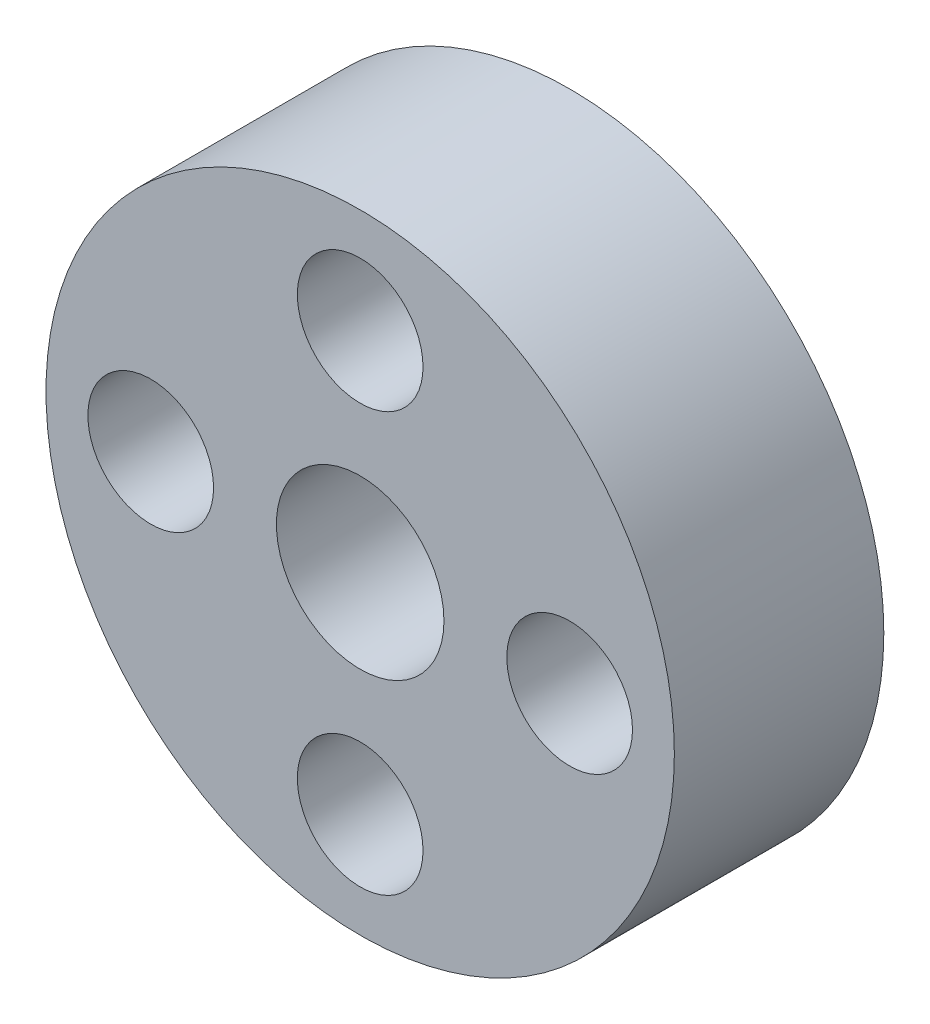
ISO-10303-21;
HEADER;
FILE_DESCRIPTION(('STEP AP214'),'2;1');
FILE_NAME('part.step','',(''),(''),'','','');
FILE_SCHEMA(('AUTOMOTIVE_DESIGN { 1 0 10303 214 1 1 1 1 }'));
ENDSEC;
DATA;
#1=APPLICATION_CONTEXT('core data for automotive mechanical design processes');
#2=APPLICATION_PROTOCOL_DEFINITION('international standard','automotive_design',2000,#1);
#3=PRODUCT_CONTEXT('',#1,'mechanical');
#4=PRODUCT('Part','Part','',(#3));
#5=PRODUCT_RELATED_PRODUCT_CATEGORY('part','',(#4));
#6=PRODUCT_DEFINITION_FORMATION('','',#4);
#7=PRODUCT_DEFINITION_CONTEXT('part definition',#1,'design');
#8=PRODUCT_DEFINITION('design','',#6,#7);
#9=PRODUCT_DEFINITION_SHAPE('','',#8);
#10=(LENGTH_UNIT() NAMED_UNIT(*) SI_UNIT(.MILLI.,.METRE.));
#11=(NAMED_UNIT(*) PLANE_ANGLE_UNIT() SI_UNIT($,.RADIAN.));
#12=(NAMED_UNIT(*) SI_UNIT($,.STERADIAN.) SOLID_ANGLE_UNIT());
#13=UNCERTAINTY_MEASURE_WITH_UNIT(LENGTH_MEASURE(1.E-05),#10,'distance_accuracy_value','');
#14=(GEOMETRIC_REPRESENTATION_CONTEXT(3) GLOBAL_UNCERTAINTY_ASSIGNED_CONTEXT((#13)) GLOBAL_UNIT_ASSIGNED_CONTEXT((#10,
#11,#12)) REPRESENTATION_CONTEXT('',''));
#15=CARTESIAN_POINT('',(0.,0.,0.));
#16=DIRECTION('',(0.,0.,1.));
#17=DIRECTION('',(1.,0.,0.));
#18=AXIS2_PLACEMENT_3D('',#15,#16,#17);
#19=CARTESIAN_POINT('',(0.,0.,10.));
#20=DIRECTION('',(0.,0.,1.));
#21=DIRECTION('',(1.,0.,0.));
#22=AXIS2_PLACEMENT_3D('',#19,#20,#21);
#23=PLANE('',#22);
#24=CARTESIAN_POINT('',(0.,-10.,10.));
#25=DIRECTION('',(0.,0.,1.));
#26=DIRECTION('',(1.,0.,0.));
#27=AXIS2_PLACEMENT_3D('',#24,#25,#26);
#28=CIRCLE('',#27,3.);
#29=CARTESIAN_POINT('',(3.,-10.,10.));
#30=VERTEX_POINT('',#29);
#31=EDGE_CURVE('E62',#30,#30,#28,.T.);
#32=ORIENTED_EDGE('',*,*,#31,.F.);
#33=EDGE_LOOP('',(#32));
#34=FACE_BOUND('',#33,.T.);
#35=CARTESIAN_POINT('',(0.,0.,10.));
#36=DIRECTION('',(0.,0.,1.));
#37=DIRECTION('',(1.,0.,0.));
#38=AXIS2_PLACEMENT_3D('',#35,#36,#37);
#39=CIRCLE('',#38,4.00000000000002);
#40=CARTESIAN_POINT('',(4.00000000000002,0.,10.));
#41=VERTEX_POINT('',#40);
#42=EDGE_CURVE('E50',#41,#41,#39,.T.);
#43=ORIENTED_EDGE('',*,*,#42,.F.);
#44=EDGE_LOOP('',(#43));
#45=FACE_BOUND('',#44,.T.);
#46=CARTESIAN_POINT('',(0.,0.,10.));
#47=DIRECTION('',(0.,0.,1.));
#48=DIRECTION('',(1.,0.,0.));
#49=AXIS2_PLACEMENT_3D('',#46,#47,#48);
#50=CIRCLE('',#49,15.);
#51=CARTESIAN_POINT('',(15.,0.,10.));
#52=VERTEX_POINT('',#51);
#53=EDGE_CURVE('E10',#52,#52,#50,.T.);
#54=ORIENTED_EDGE('',*,*,#53,.T.);
#55=EDGE_LOOP('',(#54));
#56=FACE_BOUND('',#55,.T.);
#57=CARTESIAN_POINT('',(0.,10.,10.));
#58=DIRECTION('',(0.,0.,1.));
#59=DIRECTION('',(1.,0.,0.));
#60=AXIS2_PLACEMENT_3D('',#57,#58,#59);
#61=CIRCLE('',#60,3.);
#62=CARTESIAN_POINT('',(3.,10.,10.));
#63=VERTEX_POINT('',#62);
#64=EDGE_CURVE('E45',#63,#63,#61,.T.);
#65=ORIENTED_EDGE('',*,*,#64,.F.);
#66=EDGE_LOOP('',(#65));
#67=FACE_BOUND('',#66,.T.);
#68=CARTESIAN_POINT('',(10.0000000000001,0.,10.));
#69=DIRECTION('',(0.,0.,1.));
#70=DIRECTION('',(1.,0.,0.));
#71=AXIS2_PLACEMENT_3D('',#68,#69,#70);
#72=CIRCLE('',#71,3.);
#73=CARTESIAN_POINT('',(13.0000000000001,0.,10.));
#74=VERTEX_POINT('',#73);
#75=EDGE_CURVE('E56',#74,#74,#72,.T.);
#76=ORIENTED_EDGE('',*,*,#75,.F.);
#77=EDGE_LOOP('',(#76));
#78=FACE_BOUND('',#77,.T.);
#79=CARTESIAN_POINT('',(-9.99999999999999,0.,10.));
#80=DIRECTION('',(0.,0.,1.));
#81=DIRECTION('',(1.,0.,0.));
#82=AXIS2_PLACEMENT_3D('',#79,#80,#81);
#83=CIRCLE('',#82,3.);
#84=CARTESIAN_POINT('',(-6.99999999999999,0.,10.));
#85=VERTEX_POINT('',#84);
#86=EDGE_CURVE('E68',#85,#85,#83,.T.);
#87=ORIENTED_EDGE('',*,*,#86,.F.);
#88=EDGE_LOOP('',(#87));
#89=FACE_BOUND('',#88,.T.);
#90=ADVANCED_FACE('F34',(#34,#45,#56,#67,#78,#89),#23,.T.);
#91=CARTESIAN_POINT('',(0.,0.,0.));
#92=DIRECTION('',(0.,0.,1.));
#93=DIRECTION('',(1.,0.,0.));
#94=AXIS2_PLACEMENT_3D('',#91,#92,#93);
#95=PLANE('',#94);
#96=CARTESIAN_POINT('',(0.,0.,0.));
#97=DIRECTION('',(0.,0.,1.));
#98=DIRECTION('',(1.,0.,0.));
#99=AXIS2_PLACEMENT_3D('',#96,#97,#98);
#100=CIRCLE('',#99,15.);
#101=CARTESIAN_POINT('',(15.,0.,0.));
#102=VERTEX_POINT('',#101);
#103=EDGE_CURVE('E38',#102,#102,#100,.T.);
#104=ORIENTED_EDGE('',*,*,#103,.F.);
#105=EDGE_LOOP('',(#104));
#106=FACE_BOUND('',#105,.T.);
#107=CARTESIAN_POINT('',(0.,10.,0.));
#108=DIRECTION('',(0.,0.,1.));
#109=DIRECTION('',(1.,0.,0.));
#110=AXIS2_PLACEMENT_3D('',#107,#108,#109);
#111=CIRCLE('',#110,3.);
#112=CARTESIAN_POINT('',(3.,10.,0.));
#113=VERTEX_POINT('',#112);
#114=EDGE_CURVE('E47',#113,#113,#111,.T.);
#115=ORIENTED_EDGE('',*,*,#114,.T.);
#116=EDGE_LOOP('',(#115));
#117=FACE_BOUND('',#116,.T.);
#118=CARTESIAN_POINT('',(0.,0.,0.));
#119=DIRECTION('',(0.,0.,1.));
#120=DIRECTION('',(1.,0.,0.));
#121=AXIS2_PLACEMENT_3D('',#118,#119,#120);
#122=CIRCLE('',#121,4.00000000000002);
#123=CARTESIAN_POINT('',(4.00000000000002,0.,0.));
#124=VERTEX_POINT('',#123);
#125=EDGE_CURVE('E53',#124,#124,#122,.T.);
#126=ORIENTED_EDGE('',*,*,#125,.T.);
#127=EDGE_LOOP('',(#126));
#128=FACE_BOUND('',#127,.T.);
#129=CARTESIAN_POINT('',(10.0000000000001,0.,0.));
#130=DIRECTION('',(0.,0.,1.));
#131=DIRECTION('',(1.,0.,0.));
#132=AXIS2_PLACEMENT_3D('',#129,#130,#131);
#133=CIRCLE('',#132,3.);
#134=CARTESIAN_POINT('',(13.0000000000001,0.,0.));
#135=VERTEX_POINT('',#134);
#136=EDGE_CURVE('E59',#135,#135,#133,.T.);
#137=ORIENTED_EDGE('',*,*,#136,.T.);
#138=EDGE_LOOP('',(#137));
#139=FACE_BOUND('',#138,.T.);
#140=CARTESIAN_POINT('',(0.,-10.,0.));
#141=DIRECTION('',(0.,0.,1.));
#142=DIRECTION('',(1.,0.,0.));
#143=AXIS2_PLACEMENT_3D('',#140,#141,#142);
#144=CIRCLE('',#143,3.);
#145=CARTESIAN_POINT('',(3.,-10.,0.));
#146=VERTEX_POINT('',#145);
#147=EDGE_CURVE('E65',#146,#146,#144,.T.);
#148=ORIENTED_EDGE('',*,*,#147,.T.);
#149=EDGE_LOOP('',(#148));
#150=FACE_BOUND('',#149,.T.);
#151=CARTESIAN_POINT('',(-9.99999999999999,0.,0.));
#152=DIRECTION('',(0.,0.,1.));
#153=DIRECTION('',(1.,0.,0.));
#154=AXIS2_PLACEMENT_3D('',#151,#152,#153);
#155=CIRCLE('',#154,3.);
#156=CARTESIAN_POINT('',(-6.99999999999999,0.,0.));
#157=VERTEX_POINT('',#156);
#158=EDGE_CURVE('E71',#157,#157,#155,.T.);
#159=ORIENTED_EDGE('',*,*,#158,.T.);
#160=EDGE_LOOP('',(#159));
#161=FACE_BOUND('',#160,.T.);
#162=ADVANCED_FACE('F81',(#106,#117,#128,#139,#150,#161),#95,.F.);
#163=CARTESIAN_POINT('',(0.,0.,10.));
#164=DIRECTION('',(0.,0.,-1.));
#165=DIRECTION('',(-1.,0.,0.));
#166=AXIS2_PLACEMENT_3D('',#163,#164,#165);
#167=CYLINDRICAL_SURFACE('',#166,15.);
#168=ORIENTED_EDGE('',*,*,#53,.F.);
#169=EDGE_LOOP('',(#168));
#170=FACE_BOUND('',#169,.T.);
#171=ORIENTED_EDGE('',*,*,#103,.T.);
#172=EDGE_LOOP('',(#171));
#173=FACE_BOUND('',#172,.T.);
#174=ADVANCED_FACE('F36',(#170,#173),#167,.T.);
#175=CARTESIAN_POINT('',(0.,10.,10.));
#176=DIRECTION('',(0.,0.,-1.));
#177=DIRECTION('',(-1.,0.,0.));
#178=AXIS2_PLACEMENT_3D('',#175,#176,#177);
#179=CYLINDRICAL_SURFACE('',#178,3.);
#180=ORIENTED_EDGE('',*,*,#64,.T.);
#181=EDGE_LOOP('',(#180));
#182=FACE_BOUND('',#181,.T.);
#183=ORIENTED_EDGE('',*,*,#114,.F.);
#184=EDGE_LOOP('',(#183));
#185=FACE_BOUND('',#184,.T.);
#186=ADVANCED_FACE('F91',(#182,#185),#179,.F.);
#187=CARTESIAN_POINT('',(0.,0.,10.));
#188=DIRECTION('',(0.,0.,-1.));
#189=DIRECTION('',(-1.,0.,0.));
#190=AXIS2_PLACEMENT_3D('',#187,#188,#189);
#191=CYLINDRICAL_SURFACE('',#190,4.00000000000002);
#192=ORIENTED_EDGE('',*,*,#42,.T.);
#193=EDGE_LOOP('',(#192));
#194=FACE_BOUND('',#193,.T.);
#195=ORIENTED_EDGE('',*,*,#125,.F.);
#196=EDGE_LOOP('',(#195));
#197=FACE_BOUND('',#196,.T.);
#198=ADVANCED_FACE('F94',(#194,#197),#191,.F.);
#199=CARTESIAN_POINT('',(10.0000000000001,0.,10.));
#200=DIRECTION('',(0.,0.,-1.));
#201=DIRECTION('',(-1.,0.,0.));
#202=AXIS2_PLACEMENT_3D('',#199,#200,#201);
#203=CYLINDRICAL_SURFACE('',#202,3.);
#204=ORIENTED_EDGE('',*,*,#75,.T.);
#205=EDGE_LOOP('',(#204));
#206=FACE_BOUND('',#205,.T.);
#207=ORIENTED_EDGE('',*,*,#136,.F.);
#208=EDGE_LOOP('',(#207));
#209=FACE_BOUND('',#208,.T.);
#210=ADVANCED_FACE('F98',(#206,#209),#203,.F.);
#211=CARTESIAN_POINT('',(0.,-10.,10.));
#212=DIRECTION('',(0.,0.,-1.));
#213=DIRECTION('',(-1.,0.,0.));
#214=AXIS2_PLACEMENT_3D('',#211,#212,#213);
#215=CYLINDRICAL_SURFACE('',#214,3.);
#216=ORIENTED_EDGE('',*,*,#31,.T.);
#217=EDGE_LOOP('',(#216));
#218=FACE_BOUND('',#217,.T.);
#219=ORIENTED_EDGE('',*,*,#147,.F.);
#220=EDGE_LOOP('',(#219));
#221=FACE_BOUND('',#220,.T.);
#222=ADVANCED_FACE('F102',(#218,#221),#215,.F.);
#223=CARTESIAN_POINT('',(-9.99999999999999,0.,10.));
#224=DIRECTION('',(0.,0.,-1.));
#225=DIRECTION('',(-1.,0.,0.));
#226=AXIS2_PLACEMENT_3D('',#223,#224,#225);
#227=CYLINDRICAL_SURFACE('',#226,3.);
#228=ORIENTED_EDGE('',*,*,#86,.T.);
#229=EDGE_LOOP('',(#228));
#230=FACE_BOUND('',#229,.T.);
#231=ORIENTED_EDGE('',*,*,#158,.F.);
#232=EDGE_LOOP('',(#231));
#233=FACE_BOUND('',#232,.T.);
#234=ADVANCED_FACE('F77',(#230,#233),#227,.F.);
#235=CLOSED_SHELL('',(#90,#162,#174,#186,#198,#210,#222,#234));
#236=MANIFOLD_SOLID_BREP('B2',#235);
#237=ADVANCED_BREP_SHAPE_REPRESENTATION('',(#18,#236),#14);
#238=SHAPE_DEFINITION_REPRESENTATION(#9,#237);
ENDSEC;
END-ISO-10303-21;
